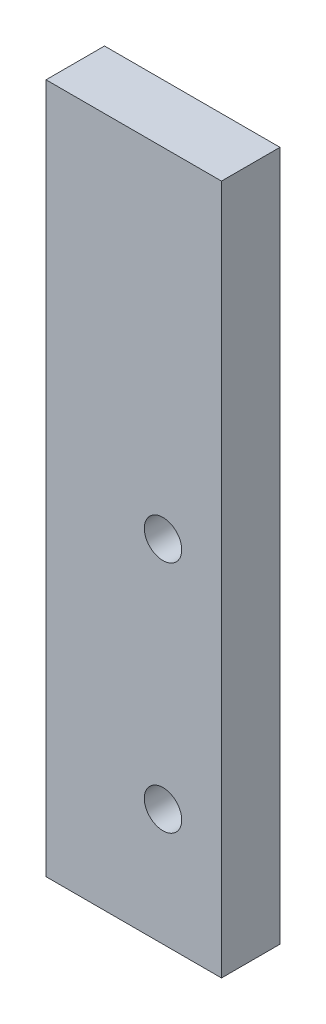
ISO-10303-21;
HEADER;
FILE_DESCRIPTION(('STEP AP214'),'2;1');
FILE_NAME('part.step','',(''),(''),'','','');
FILE_SCHEMA(('AUTOMOTIVE_DESIGN { 1 0 10303 214 1 1 1 1 }'));
ENDSEC;
DATA;
#1=APPLICATION_CONTEXT('core data for automotive mechanical design processes');
#2=APPLICATION_PROTOCOL_DEFINITION('international standard','automotive_design',2000,#1);
#3=PRODUCT_CONTEXT('',#1,'mechanical');
#4=PRODUCT('Part','Part','',(#3));
#5=PRODUCT_RELATED_PRODUCT_CATEGORY('part','',(#4));
#6=PRODUCT_DEFINITION_FORMATION('','',#4);
#7=PRODUCT_DEFINITION_CONTEXT('part definition',#1,'design');
#8=PRODUCT_DEFINITION('design','',#6,#7);
#9=PRODUCT_DEFINITION_SHAPE('','',#8);
#10=(LENGTH_UNIT() NAMED_UNIT(*) SI_UNIT(.MILLI.,.METRE.));
#11=(NAMED_UNIT(*) PLANE_ANGLE_UNIT() SI_UNIT($,.RADIAN.));
#12=(NAMED_UNIT(*) SI_UNIT($,.STERADIAN.) SOLID_ANGLE_UNIT());
#13=UNCERTAINTY_MEASURE_WITH_UNIT(LENGTH_MEASURE(1.E-05),#10,'distance_accuracy_value','');
#14=(GEOMETRIC_REPRESENTATION_CONTEXT(3) GLOBAL_UNCERTAINTY_ASSIGNED_CONTEXT((#13)) GLOBAL_UNIT_ASSIGNED_CONTEXT((#10,
#11,#12)) REPRESENTATION_CONTEXT('',''));
#15=CARTESIAN_POINT('',(0.,0.,0.));
#16=DIRECTION('',(0.,0.,1.));
#17=DIRECTION('',(1.,0.,0.));
#18=AXIS2_PLACEMENT_3D('',#15,#16,#17);
#19=CARTESIAN_POINT('',(0.,0.,5.));
#20=DIRECTION('',(1.,0.,0.));
#21=DIRECTION('',(0.,0.,-1.));
#22=AXIS2_PLACEMENT_3D('',#19,#20,#21);
#23=PLANE('',#22);
#24=DIRECTION('',(0.,-1.,0.));
#25=VECTOR('',#24,1.);
#26=CARTESIAN_POINT('',(0.,0.,0.));
#27=LINE('',#26,#25);
#28=CARTESIAN_POINT('',(0.,59.,0.));
#29=VERTEX_POINT('',#28);
#30=CARTESIAN_POINT('',(0.,0.,0.));
#31=VERTEX_POINT('',#30);
#32=EDGE_CURVE('E121',#29,#31,#27,.T.);
#33=ORIENTED_EDGE('',*,*,#32,.T.);
#34=DIRECTION('',(0.,0.,-1.));
#35=VECTOR('',#34,1.);
#36=CARTESIAN_POINT('',(0.,0.,5.));
#37=LINE('',#36,#35);
#38=CARTESIAN_POINT('',(0.,0.,5.));
#39=VERTEX_POINT('',#38);
#40=EDGE_CURVE('E12',#39,#31,#37,.T.);
#41=ORIENTED_EDGE('',*,*,#40,.F.);
#42=DIRECTION('',(0.,-1.,0.));
#43=VECTOR('',#42,1.);
#44=CARTESIAN_POINT('',(0.,0.,5.));
#45=LINE('',#44,#43);
#46=CARTESIAN_POINT('',(0.,59.,5.));
#47=VERTEX_POINT('',#46);
#48=EDGE_CURVE('E88',#47,#39,#45,.T.);
#49=ORIENTED_EDGE('',*,*,#48,.F.);
#50=DIRECTION('',(0.,0.,-1.));
#51=VECTOR('',#50,1.);
#52=CARTESIAN_POINT('',(0.,59.,5.));
#53=LINE('',#52,#51);
#54=EDGE_CURVE('E96',#47,#29,#53,.T.);
#55=ORIENTED_EDGE('',*,*,#54,.T.);
#56=EDGE_LOOP('',(#33,#41,#49,#55));
#57=FACE_BOUND('',#56,.T.);
#58=ADVANCED_FACE('F37',(#57),#23,.F.);
#59=CARTESIAN_POINT('',(0.,0.,5.));
#60=DIRECTION('',(0.,1.,0.));
#61=DIRECTION('',(0.,0.,1.));
#62=AXIS2_PLACEMENT_3D('',#59,#60,#61);
#63=PLANE('',#62);
#64=DIRECTION('',(1.,0.,0.));
#65=VECTOR('',#64,1.);
#66=CARTESIAN_POINT('',(0.,0.,0.));
#67=LINE('',#66,#65);
#68=CARTESIAN_POINT('',(15.,0.,0.));
#69=VERTEX_POINT('',#68);
#70=EDGE_CURVE('E92',#31,#69,#67,.T.);
#71=ORIENTED_EDGE('',*,*,#70,.T.);
#72=DIRECTION('',(0.,0.,-1.));
#73=VECTOR('',#72,1.);
#74=CARTESIAN_POINT('',(15.,0.,5.));
#75=LINE('',#74,#73);
#76=CARTESIAN_POINT('',(15.,0.,5.));
#77=VERTEX_POINT('',#76);
#78=EDGE_CURVE('E45',#77,#69,#75,.T.);
#79=ORIENTED_EDGE('',*,*,#78,.F.);
#80=DIRECTION('',(1.,0.,0.));
#81=VECTOR('',#80,1.);
#82=CARTESIAN_POINT('',(0.,0.,5.));
#83=LINE('',#82,#81);
#84=EDGE_CURVE('E83',#39,#77,#83,.T.);
#85=ORIENTED_EDGE('',*,*,#84,.F.);
#86=ORIENTED_EDGE('',*,*,#40,.T.);
#87=EDGE_LOOP('',(#71,#79,#85,#86));
#88=FACE_BOUND('',#87,.T.);
#89=ADVANCED_FACE('F91',(#88),#63,.F.);
#90=CARTESIAN_POINT('',(15.,0.,5.));
#91=DIRECTION('',(-1.,0.,0.));
#92=DIRECTION('',(0.,0.,1.));
#93=AXIS2_PLACEMENT_3D('',#90,#91,#92);
#94=PLANE('',#93);
#95=DIRECTION('',(0.,1.,0.));
#96=VECTOR('',#95,1.);
#97=CARTESIAN_POINT('',(15.,0.,0.));
#98=LINE('',#97,#96);
#99=CARTESIAN_POINT('',(15.,59.,0.));
#100=VERTEX_POINT('',#99);
#101=EDGE_CURVE('E70',#69,#100,#98,.T.);
#102=ORIENTED_EDGE('',*,*,#101,.T.);
#103=DIRECTION('',(0.,0.,-1.));
#104=VECTOR('',#103,1.);
#105=CARTESIAN_POINT('',(15.,59.,5.));
#106=LINE('',#105,#104);
#107=CARTESIAN_POINT('',(15.,59.,5.));
#108=VERTEX_POINT('',#107);
#109=EDGE_CURVE('E93',#108,#100,#106,.T.);
#110=ORIENTED_EDGE('',*,*,#109,.F.);
#111=DIRECTION('',(0.,1.,0.));
#112=VECTOR('',#111,1.);
#113=CARTESIAN_POINT('',(15.,0.,5.));
#114=LINE('',#113,#112);
#115=EDGE_CURVE('E86',#77,#108,#114,.T.);
#116=ORIENTED_EDGE('',*,*,#115,.F.);
#117=ORIENTED_EDGE('',*,*,#78,.T.);
#118=EDGE_LOOP('',(#102,#110,#116,#117));
#119=FACE_BOUND('',#118,.T.);
#120=ADVANCED_FACE('F94',(#119),#94,.F.);
#121=CARTESIAN_POINT('',(0.,59.,5.));
#122=DIRECTION('',(0.,-1.,0.));
#123=DIRECTION('',(0.,0.,-1.));
#124=AXIS2_PLACEMENT_3D('',#121,#122,#123);
#125=PLANE('',#124);
#126=DIRECTION('',(-1.,0.,0.));
#127=VECTOR('',#126,1.);
#128=CARTESIAN_POINT('',(0.,59.,0.));
#129=LINE('',#128,#127);
#130=EDGE_CURVE('E76',#100,#29,#129,.T.);
#131=ORIENTED_EDGE('',*,*,#130,.T.);
#132=ORIENTED_EDGE('',*,*,#54,.F.);
#133=DIRECTION('',(-1.,0.,0.));
#134=VECTOR('',#133,1.);
#135=CARTESIAN_POINT('',(0.,59.,5.));
#136=LINE('',#135,#134);
#137=EDGE_CURVE('E53',#108,#47,#136,.T.);
#138=ORIENTED_EDGE('',*,*,#137,.F.);
#139=ORIENTED_EDGE('',*,*,#109,.T.);
#140=EDGE_LOOP('',(#131,#132,#138,#139));
#141=FACE_BOUND('',#140,.T.);
#142=ADVANCED_FACE('F132',(#141),#125,.F.);
#143=CARTESIAN_POINT('',(0.,0.,5.));
#144=DIRECTION('',(0.,0.,-1.));
#145=DIRECTION('',(-1.,0.,0.));
#146=AXIS2_PLACEMENT_3D('',#143,#144,#145);
#147=PLANE('',#146);
#148=CARTESIAN_POINT('',(10.,10.,5.));
#149=DIRECTION('',(0.,0.,1.));
#150=DIRECTION('',(1.,0.,0.));
#151=AXIS2_PLACEMENT_3D('',#148,#149,#150);
#152=CIRCLE('',#151,1.6);
#153=CARTESIAN_POINT('',(11.6,10.,5.));
#154=VERTEX_POINT('',#153);
#155=EDGE_CURVE('E115',#154,#154,#152,.T.);
#156=ORIENTED_EDGE('',*,*,#155,.F.);
#157=EDGE_LOOP('',(#156));
#158=FACE_BOUND('',#157,.T.);
#159=CARTESIAN_POINT('',(10.,30.,5.));
#160=DIRECTION('',(0.,0.,1.));
#161=DIRECTION('',(1.,0.,0.));
#162=AXIS2_PLACEMENT_3D('',#159,#160,#161);
#163=CIRCLE('',#162,1.6);
#164=CARTESIAN_POINT('',(11.6,30.,5.));
#165=VERTEX_POINT('',#164);
#166=EDGE_CURVE('E108',#165,#165,#163,.T.);
#167=ORIENTED_EDGE('',*,*,#166,.F.);
#168=EDGE_LOOP('',(#167));
#169=FACE_BOUND('',#168,.T.);
#170=ORIENTED_EDGE('',*,*,#48,.T.);
#171=ORIENTED_EDGE('',*,*,#84,.T.);
#172=ORIENTED_EDGE('',*,*,#115,.T.);
#173=ORIENTED_EDGE('',*,*,#137,.T.);
#174=EDGE_LOOP('',(#170,#171,#172,#173));
#175=FACE_BOUND('',#174,.T.);
#176=ADVANCED_FACE('F84',(#158,#169,#175),#147,.F.);
#177=CARTESIAN_POINT('',(0.,0.,0.));
#178=DIRECTION('',(0.,0.,-1.));
#179=DIRECTION('',(-1.,0.,0.));
#180=AXIS2_PLACEMENT_3D('',#177,#178,#179);
#181=PLANE('',#180);
#182=CARTESIAN_POINT('',(10.,10.,0.));
#183=DIRECTION('',(0.,0.,1.));
#184=DIRECTION('',(1.,0.,0.));
#185=AXIS2_PLACEMENT_3D('',#182,#183,#184);
#186=CIRCLE('',#185,1.6);
#187=CARTESIAN_POINT('',(11.6,10.,0.));
#188=VERTEX_POINT('',#187);
#189=EDGE_CURVE('E119',#188,#188,#186,.T.);
#190=ORIENTED_EDGE('',*,*,#189,.T.);
#191=EDGE_LOOP('',(#190));
#192=FACE_BOUND('',#191,.T.);
#193=CARTESIAN_POINT('',(10.,30.,0.));
#194=DIRECTION('',(0.,0.,1.));
#195=DIRECTION('',(1.,0.,0.));
#196=AXIS2_PLACEMENT_3D('',#193,#194,#195);
#197=CIRCLE('',#196,1.6);
#198=CARTESIAN_POINT('',(11.6,30.,0.));
#199=VERTEX_POINT('',#198);
#200=EDGE_CURVE('E112',#199,#199,#197,.T.);
#201=ORIENTED_EDGE('',*,*,#200,.T.);
#202=EDGE_LOOP('',(#201));
#203=FACE_BOUND('',#202,.T.);
#204=ORIENTED_EDGE('',*,*,#32,.F.);
#205=ORIENTED_EDGE('',*,*,#130,.F.);
#206=ORIENTED_EDGE('',*,*,#101,.F.);
#207=ORIENTED_EDGE('',*,*,#70,.F.);
#208=EDGE_LOOP('',(#204,#205,#206,#207));
#209=FACE_BOUND('',#208,.T.);
#210=ADVANCED_FACE('F134',(#192,#203,#209),#181,.T.);
#211=CARTESIAN_POINT('',(10.,30.,0.));
#212=DIRECTION('',(0.,0.,1.));
#213=DIRECTION('',(1.,0.,0.));
#214=AXIS2_PLACEMENT_3D('',#211,#212,#213);
#215=CYLINDRICAL_SURFACE('',#214,1.6);
#216=ORIENTED_EDGE('',*,*,#200,.F.);
#217=EDGE_LOOP('',(#216));
#218=FACE_BOUND('',#217,.T.);
#219=ORIENTED_EDGE('',*,*,#166,.T.);
#220=EDGE_LOOP('',(#219));
#221=FACE_BOUND('',#220,.T.);
#222=ADVANCED_FACE('F148',(#218,#221),#215,.F.);
#223=CARTESIAN_POINT('',(10.,10.,0.));
#224=DIRECTION('',(0.,0.,1.));
#225=DIRECTION('',(1.,0.,0.));
#226=AXIS2_PLACEMENT_3D('',#223,#224,#225);
#227=CYLINDRICAL_SURFACE('',#226,1.6);
#228=ORIENTED_EDGE('',*,*,#189,.F.);
#229=EDGE_LOOP('',(#228));
#230=FACE_BOUND('',#229,.T.);
#231=ORIENTED_EDGE('',*,*,#155,.T.);
#232=EDGE_LOOP('',(#231));
#233=FACE_BOUND('',#232,.T.);
#234=ADVANCED_FACE('F154',(#230,#233),#227,.F.);
#235=CLOSED_SHELL('',(#58,#89,#120,#142,#176,#210,#222,#234));
#236=MANIFOLD_SOLID_BREP('B2',#235);
#237=ADVANCED_BREP_SHAPE_REPRESENTATION('',(#18,#236),#14);
#238=SHAPE_DEFINITION_REPRESENTATION(#9,#237);
ENDSEC;
END-ISO-10303-21;
